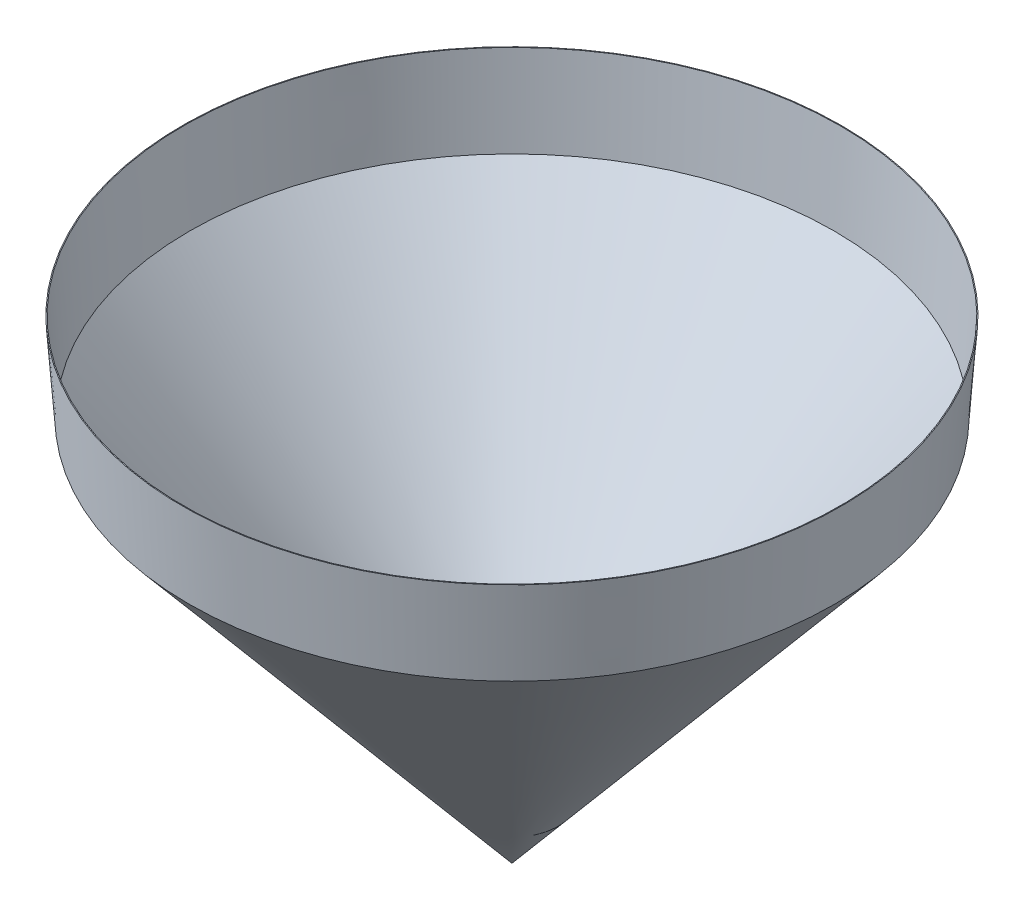
ISO-10303-21;
HEADER;
FILE_DESCRIPTION(('STEP AP214'),'2;1');
FILE_NAME('part.step','',(''),(''),'','','');
FILE_SCHEMA(('AUTOMOTIVE_DESIGN { 1 0 10303 214 1 1 1 1 }'));
ENDSEC;
DATA;
#1=APPLICATION_CONTEXT('core data for automotive mechanical design processes');
#2=APPLICATION_PROTOCOL_DEFINITION('international standard','automotive_design',2000,#1);
#3=PRODUCT_CONTEXT('',#1,'mechanical');
#4=PRODUCT('Part','Part','',(#3));
#5=PRODUCT_RELATED_PRODUCT_CATEGORY('part','',(#4));
#6=PRODUCT_DEFINITION_FORMATION('','',#4);
#7=PRODUCT_DEFINITION_CONTEXT('part definition',#1,'design');
#8=PRODUCT_DEFINITION('design','',#6,#7);
#9=PRODUCT_DEFINITION_SHAPE('','',#8);
#10=(LENGTH_UNIT() NAMED_UNIT(*) SI_UNIT(.MILLI.,.METRE.));
#11=(NAMED_UNIT(*) PLANE_ANGLE_UNIT() SI_UNIT($,.RADIAN.));
#12=(NAMED_UNIT(*) SI_UNIT($,.STERADIAN.) SOLID_ANGLE_UNIT());
#13=UNCERTAINTY_MEASURE_WITH_UNIT(LENGTH_MEASURE(1.E-05),#10,'distance_accuracy_value','');
#14=(GEOMETRIC_REPRESENTATION_CONTEXT(3) GLOBAL_UNCERTAINTY_ASSIGNED_CONTEXT((#13)) GLOBAL_UNIT_ASSIGNED_CONTEXT((#10,
#11,#12)) REPRESENTATION_CONTEXT('',''));
#15=CARTESIAN_POINT('',(0.,0.,0.));
#16=DIRECTION('',(0.,0.,1.));
#17=DIRECTION('',(1.,0.,0.));
#18=AXIS2_PLACEMENT_3D('',#15,#16,#17);
#19=CARTESIAN_POINT('',(0.,56.4272839788842,39.2199625315803));
#20=DIRECTION('',(0.,-1.,0.));
#21=DIRECTION('',(0.,0.,-1.));
#22=AXIS2_PLACEMENT_3D('',#19,#20,#21);
#23=PLANE('',#22);
#24=CARTESIAN_POINT('',(0.,56.4272839788842,0.));
#25=DIRECTION('',(0.,-1.,0.));
#26=DIRECTION('',(0.,0.,-1.));
#27=AXIS2_PLACEMENT_3D('',#24,#25,#26);
#28=CIRCLE('',#27,39.1196940032288);
#29=CARTESIAN_POINT('',(0.,56.4272839788842,-39.1196940032288));
#30=VERTEX_POINT('',#29);
#31=EDGE_CURVE('E63',#30,#30,#28,.T.);
#32=ORIENTED_EDGE('',*,*,#31,.T.);
#33=EDGE_LOOP('',(#32));
#34=FACE_BOUND('',#33,.T.);
#35=CARTESIAN_POINT('',(0.,56.4272839788842,0.));
#36=DIRECTION('',(0.,-1.,0.));
#37=DIRECTION('',(0.,0.,-1.));
#38=AXIS2_PLACEMENT_3D('',#35,#36,#37);
#39=CIRCLE('',#38,39.2199625315803);
#40=CARTESIAN_POINT('',(0.,56.4272839788842,-39.2199625315803));
#41=VERTEX_POINT('',#40);
#42=EDGE_CURVE('E11',#41,#41,#39,.T.);
#43=ORIENTED_EDGE('',*,*,#42,.F.);
#44=EDGE_LOOP('',(#43));
#45=FACE_BOUND('',#44,.T.);
#46=ADVANCED_FACE('F39',(#34,#45),#23,.F.);
#47=CARTESIAN_POINT('',(0.,56.4272839788842,0.));
#48=DIRECTION('',(0.,1.,0.));
#49=DIRECTION('',(0.,0.,1.));
#50=AXIS2_PLACEMENT_3D('',#47,#48,#49);
#51=CONICAL_SURFACE('',#50,39.2199625315803,0.0732022990878968);
#52=CARTESIAN_POINT('',(0.,45.9492775609474,0.));
#53=DIRECTION('',(0.,-1.,0.));
#54=DIRECTION('',(0.,0.,-1.));
#55=AXIS2_PLACEMENT_3D('',#52,#53,#54);
#56=CIRCLE('',#55,38.4515753942649);
#57=CARTESIAN_POINT('',(0.,45.9492775609474,-38.4515753942649));
#58=VERTEX_POINT('',#57);
#59=EDGE_CURVE('E47',#58,#58,#56,.T.);
#60=ORIENTED_EDGE('',*,*,#59,.F.);
#61=EDGE_LOOP('',(#60));
#62=FACE_BOUND('',#61,.T.);
#63=ORIENTED_EDGE('',*,*,#42,.T.);
#64=EDGE_LOOP('',(#63));
#65=FACE_BOUND('',#64,.T.);
#66=ADVANCED_FACE('F74',(#62,#65),#51,.T.);
#67=CARTESIAN_POINT('',(0.,45.9492775609474,0.));
#68=DIRECTION('',(0.,1.,0.));
#69=DIRECTION('',(0.,0.,1.));
#70=AXIS2_PLACEMENT_3D('',#67,#68,#69);
#71=CONICAL_SURFACE('',#70,38.4515753942649,0.696796307847362);
#72=CARTESIAN_POINT('',(0.,0.,0.));
#73=VERTEX_POINT('',#72);
#74=VERTEX_LOOP('',#73);
#75=FACE_BOUND('',#74,.T.);
#76=ORIENTED_EDGE('',*,*,#59,.T.);
#77=EDGE_LOOP('',(#76));
#78=FACE_BOUND('',#77,.T.);
#79=ADVANCED_FACE('F72',(#75,#78),#71,.T.);
#80=CARTESIAN_POINT('',(0.,56.4345976728756,0.));
#81=DIRECTION('',(0.,1.,0.));
#82=DIRECTION('',(0.,0.,1.));
#83=AXIS2_PLACEMENT_3D('',#80,#81,#82);
#84=CONICAL_SURFACE('',#83,39.1202303407882,0.0732022990878968);
#85=CARTESIAN_POINT('',(0.,45.9887359416314,0.));
#86=DIRECTION('',(0.,-1.,0.));
#87=DIRECTION('',(0.,0.,-1.));
#88=AXIS2_PLACEMENT_3D('',#85,#86,#87);
#89=CIRCLE('',#88,38.3542004804969);
#90=CARTESIAN_POINT('',(0.,45.9887359416314,-38.3542004804969));
#91=VERTEX_POINT('',#90);
#92=EDGE_CURVE('E60',#91,#91,#89,.T.);
#93=ORIENTED_EDGE('',*,*,#92,.T.);
#94=EDGE_LOOP('',(#93));
#95=FACE_BOUND('',#94,.T.);
#96=ORIENTED_EDGE('',*,*,#31,.F.);
#97=EDGE_LOOP('',(#96));
#98=FACE_BOUND('',#97,.T.);
#99=ADVANCED_FACE('F56',(#95,#98),#84,.F.);
#100=CARTESIAN_POINT('',(0.,46.0134539675982,0.));
#101=DIRECTION('',(0.,1.,0.));
#102=DIRECTION('',(0.,0.,1.));
#103=AXIS2_PLACEMENT_3D('',#100,#101,#102);
#104=CONICAL_SURFACE('',#103,38.3748851808776,0.696796307847362);
#105=CARTESIAN_POINT('',(0.,0.155820503544353,0.));
#106=VERTEX_POINT('',#105);
#107=VERTEX_LOOP('',#106);
#108=FACE_BOUND('',#107,.T.);
#109=ORIENTED_EDGE('',*,*,#92,.F.);
#110=EDGE_LOOP('',(#109));
#111=FACE_BOUND('',#110,.T.);
#112=ADVANCED_FACE('F53',(#108,#111),#104,.F.);
#113=CLOSED_SHELL('',(#46,#66,#79,#99,#112));
#114=MANIFOLD_SOLID_BREP('B2',#113);
#115=ADVANCED_BREP_SHAPE_REPRESENTATION('',(#18,#114),#14);
#116=SHAPE_DEFINITION_REPRESENTATION(#9,#115);
ENDSEC;
END-ISO-10303-21;
